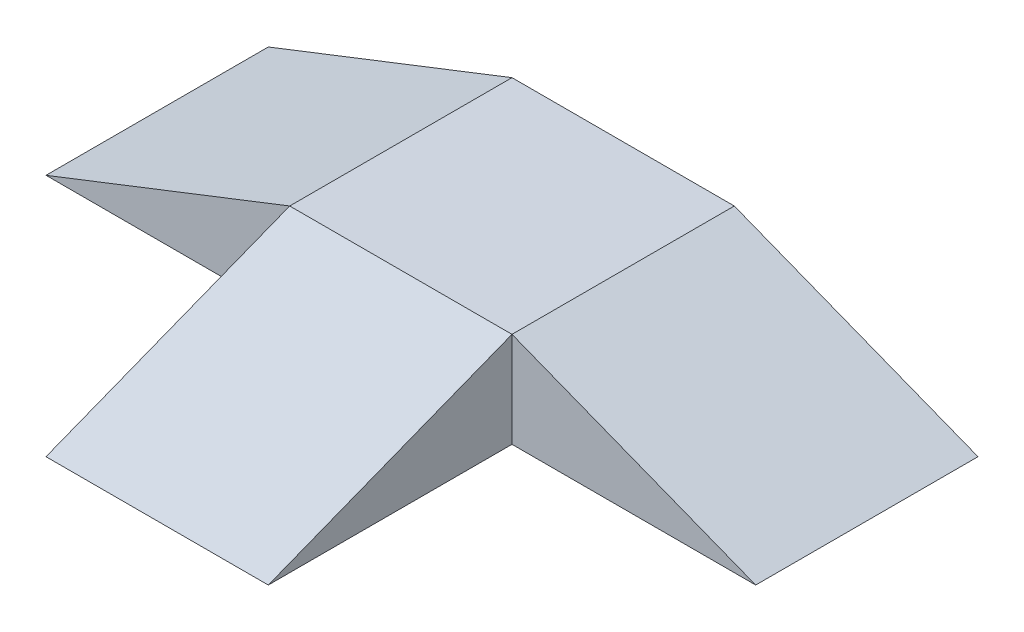
ISO-10303-21;
HEADER;
FILE_DESCRIPTION(('STEP AP214'),'2;1');
FILE_NAME('part.step','',(''),(''),'','','');
FILE_SCHEMA(('AUTOMOTIVE_DESIGN { 1 0 10303 214 1 1 1 1 }'));
ENDSEC;
DATA;
#1=APPLICATION_CONTEXT('core data for automotive mechanical design processes');
#2=APPLICATION_PROTOCOL_DEFINITION('international standard','automotive_design',2000,#1);
#3=PRODUCT_CONTEXT('',#1,'mechanical');
#4=PRODUCT('Part','Part','',(#3));
#5=PRODUCT_RELATED_PRODUCT_CATEGORY('part','',(#4));
#6=PRODUCT_DEFINITION_FORMATION('','',#4);
#7=PRODUCT_DEFINITION_CONTEXT('part definition',#1,'design');
#8=PRODUCT_DEFINITION('design','',#6,#7);
#9=PRODUCT_DEFINITION_SHAPE('','',#8);
#10=(LENGTH_UNIT() NAMED_UNIT(*) SI_UNIT(.MILLI.,.METRE.));
#11=(NAMED_UNIT(*) PLANE_ANGLE_UNIT() SI_UNIT($,.RADIAN.));
#12=(NAMED_UNIT(*) SI_UNIT($,.STERADIAN.) SOLID_ANGLE_UNIT());
#13=UNCERTAINTY_MEASURE_WITH_UNIT(LENGTH_MEASURE(1.E-05),#10,'distance_accuracy_value','');
#14=(GEOMETRIC_REPRESENTATION_CONTEXT(3) GLOBAL_UNCERTAINTY_ASSIGNED_CONTEXT((#13)) GLOBAL_UNIT_ASSIGNED_CONTEXT((#10,
#11,#12)) REPRESENTATION_CONTEXT('',''));
#15=CARTESIAN_POINT('',(0.,0.,0.));
#16=DIRECTION('',(0.,0.,1.));
#17=DIRECTION('',(1.,0.,0.));
#18=AXIS2_PLACEMENT_3D('',#15,#16,#17);
#19=CARTESIAN_POINT('',(175.,150.,175.));
#20=DIRECTION('',(-1.,0.,0.));
#21=DIRECTION('',(0.,0.,1.));
#22=AXIS2_PLACEMENT_3D('',#19,#20,#21);
#23=PLANE('',#22);
#24=DIRECTION('',(0.,-1.,0.));
#25=VECTOR('',#24,1.);
#26=CARTESIAN_POINT('',(175.,150.,175.));
#27=LINE('',#26,#25);
#28=CARTESIAN_POINT('',(175.,150.,175.));
#29=VERTEX_POINT('',#28);
#30=CARTESIAN_POINT('',(175.,0.,175.));
#31=VERTEX_POINT('',#30);
#32=EDGE_CURVE('E57',#29,#31,#27,.T.);
#33=ORIENTED_EDGE('',*,*,#32,.F.);
#34=DIRECTION('',(0.,-0.364077669902913,0.931368589913824));
#35=VECTOR('',#34,1.);
#36=CARTESIAN_POINT('',(175.,0.,558.723859044496));
#37=LINE('',#36,#35);
#38=CARTESIAN_POINT('',(175.,0.,558.723859044496));
#39=VERTEX_POINT('',#38);
#40=EDGE_CURVE('E86',#29,#39,#37,.T.);
#41=ORIENTED_EDGE('',*,*,#40,.T.);
#42=DIRECTION('',(0.,0.,-1.));
#43=VECTOR('',#42,1.);
#44=CARTESIAN_POINT('',(175.,0.,175.));
#45=LINE('',#44,#43);
#46=EDGE_CURVE('E84',#39,#31,#45,.T.);
#47=ORIENTED_EDGE('',*,*,#46,.T.);
#48=EDGE_LOOP('',(#33,#41,#47));
#49=FACE_BOUND('',#48,.T.);
#50=ADVANCED_FACE('F33',(#49),#23,.F.);
#51=CARTESIAN_POINT('',(-175.,150.,175.));
#52=DIRECTION('',(1.,0.,0.));
#53=DIRECTION('',(0.,0.,-1.));
#54=AXIS2_PLACEMENT_3D('',#51,#52,#53);
#55=PLANE('',#54);
#56=DIRECTION('',(0.,1.,0.));
#57=VECTOR('',#56,1.);
#58=CARTESIAN_POINT('',(-175.,0.,175.));
#59=LINE('',#58,#57);
#60=CARTESIAN_POINT('',(-175.,0.,175.));
#61=VERTEX_POINT('',#60);
#62=CARTESIAN_POINT('',(-175.,150.,175.));
#63=VERTEX_POINT('',#62);
#64=EDGE_CURVE('E49',#61,#63,#59,.T.);
#65=ORIENTED_EDGE('',*,*,#64,.F.);
#66=DIRECTION('',(0.,0.,1.));
#67=VECTOR('',#66,1.);
#68=CARTESIAN_POINT('',(-175.,0.,175.));
#69=LINE('',#68,#67);
#70=CARTESIAN_POINT('',(-175.,0.,558.723859044496));
#71=VERTEX_POINT('',#70);
#72=EDGE_CURVE('E36',#61,#71,#69,.T.);
#73=ORIENTED_EDGE('',*,*,#72,.T.);
#74=DIRECTION('',(0.,-0.364077669902913,0.931368589913824));
#75=VECTOR('',#74,1.);
#76=CARTESIAN_POINT('',(-175.,0.,558.723859044496));
#77=LINE('',#76,#75);
#78=EDGE_CURVE('E125',#63,#71,#77,.T.);
#79=ORIENTED_EDGE('',*,*,#78,.F.);
#80=EDGE_LOOP('',(#65,#73,#79));
#81=FACE_BOUND('',#80,.T.);
#82=ADVANCED_FACE('F139',(#81),#55,.F.);
#83=CARTESIAN_POINT('',(-175.,150.,-175.));
#84=DIRECTION('',(0.,0.,1.));
#85=DIRECTION('',(1.,0.,0.));
#86=AXIS2_PLACEMENT_3D('',#83,#84,#85);
#87=PLANE('',#86);
#88=DIRECTION('',(-1.,0.,0.));
#89=VECTOR('',#88,1.);
#90=CARTESIAN_POINT('',(-175.,0.,-175.));
#91=LINE('',#90,#89);
#92=CARTESIAN_POINT('',(558.723859044496,0.,-175.));
#93=VERTEX_POINT('',#92);
#94=CARTESIAN_POINT('',(-558.723859044496,0.,-175.));
#95=VERTEX_POINT('',#94);
#96=EDGE_CURVE('E91',#93,#95,#91,.T.);
#97=ORIENTED_EDGE('',*,*,#96,.T.);
#98=DIRECTION('',(-0.931368589913825,-0.364077669902913,0.));
#99=VECTOR('',#98,1.);
#100=CARTESIAN_POINT('',(-175.,150.,-175.));
#101=LINE('',#100,#99);
#102=CARTESIAN_POINT('',(-175.,150.,-175.));
#103=VERTEX_POINT('',#102);
#104=EDGE_CURVE('E107',#103,#95,#101,.T.);
#105=ORIENTED_EDGE('',*,*,#104,.F.);
#106=DIRECTION('',(-1.,0.,0.));
#107=VECTOR('',#106,1.);
#108=CARTESIAN_POINT('',(-175.,150.,-175.));
#109=LINE('',#108,#107);
#110=CARTESIAN_POINT('',(175.,150.,-175.));
#111=VERTEX_POINT('',#110);
#112=EDGE_CURVE('E133',#111,#103,#109,.T.);
#113=ORIENTED_EDGE('',*,*,#112,.F.);
#114=DIRECTION('',(-0.931368589913825,0.364077669902913,0.));
#115=VECTOR('',#114,1.);
#116=CARTESIAN_POINT('',(558.723859044496,0.,-175.));
#117=LINE('',#116,#115);
#118=EDGE_CURVE('E111',#93,#111,#117,.T.);
#119=ORIENTED_EDGE('',*,*,#118,.F.);
#120=EDGE_LOOP('',(#97,#105,#113,#119));
#121=FACE_BOUND('',#120,.T.);
#122=ADVANCED_FACE('F155',(#121),#87,.F.);
#123=CARTESIAN_POINT('',(0.,150.,0.));
#124=DIRECTION('',(0.,-1.,0.));
#125=DIRECTION('',(0.,0.,-1.));
#126=AXIS2_PLACEMENT_3D('',#123,#124,#125);
#127=PLANE('',#126);
#128=DIRECTION('',(0.,0.,-1.));
#129=VECTOR('',#128,1.);
#130=CARTESIAN_POINT('',(175.,150.,175.));
#131=LINE('',#130,#129);
#132=EDGE_CURVE('E130',#29,#111,#131,.T.);
#133=ORIENTED_EDGE('',*,*,#132,.T.);
#134=ORIENTED_EDGE('',*,*,#112,.T.);
#135=DIRECTION('',(0.,0.,1.));
#136=VECTOR('',#135,1.);
#137=CARTESIAN_POINT('',(-175.,150.,175.));
#138=LINE('',#137,#136);
#139=EDGE_CURVE('E41',#103,#63,#138,.T.);
#140=ORIENTED_EDGE('',*,*,#139,.T.);
#141=DIRECTION('',(1.,0.,0.));
#142=VECTOR('',#141,1.);
#143=CARTESIAN_POINT('',(-175.,150.,175.));
#144=LINE('',#143,#142);
#145=EDGE_CURVE('E11',#63,#29,#144,.T.);
#146=ORIENTED_EDGE('',*,*,#145,.T.);
#147=EDGE_LOOP('',(#133,#134,#140,#146));
#148=FACE_BOUND('',#147,.T.);
#149=ADVANCED_FACE('F147',(#148),#127,.F.);
#150=CARTESIAN_POINT('',(0.,0.,0.));
#151=DIRECTION('',(0.,-1.,0.));
#152=DIRECTION('',(0.,0.,-1.));
#153=AXIS2_PLACEMENT_3D('',#150,#151,#152);
#154=PLANE('',#153);
#155=ORIENTED_EDGE('',*,*,#46,.F.);
#156=DIRECTION('',(-1.,0.,0.));
#157=VECTOR('',#156,1.);
#158=CARTESIAN_POINT('',(175.,0.,558.723859044496));
#159=LINE('',#158,#157);
#160=EDGE_CURVE('E92',#39,#71,#159,.T.);
#161=ORIENTED_EDGE('',*,*,#160,.T.);
#162=ORIENTED_EDGE('',*,*,#72,.F.);
#163=DIRECTION('',(1.,0.,0.));
#164=VECTOR('',#163,1.);
#165=CARTESIAN_POINT('',(-558.723859044496,0.,175.));
#166=LINE('',#165,#164);
#167=CARTESIAN_POINT('',(-558.723859044496,0.,175.));
#168=VERTEX_POINT('',#167);
#169=EDGE_CURVE('E117',#168,#61,#166,.T.);
#170=ORIENTED_EDGE('',*,*,#169,.F.);
#171=DIRECTION('',(0.,0.,-1.));
#172=VECTOR('',#171,1.);
#173=CARTESIAN_POINT('',(-558.723859044496,0.,175.));
#174=LINE('',#173,#172);
#175=EDGE_CURVE('E120',#168,#95,#174,.T.);
#176=ORIENTED_EDGE('',*,*,#175,.T.);
#177=ORIENTED_EDGE('',*,*,#96,.F.);
#178=DIRECTION('',(0.,0.,-1.));
#179=VECTOR('',#178,1.);
#180=CARTESIAN_POINT('',(558.723859044496,0.,175.));
#181=LINE('',#180,#179);
#182=CARTESIAN_POINT('',(558.723859044496,0.,175.));
#183=VERTEX_POINT('',#182);
#184=EDGE_CURVE('E105',#183,#93,#181,.T.);
#185=ORIENTED_EDGE('',*,*,#184,.F.);
#186=DIRECTION('',(1.,0.,0.));
#187=VECTOR('',#186,1.);
#188=CARTESIAN_POINT('',(175.,0.,175.));
#189=LINE('',#188,#187);
#190=EDGE_CURVE('E97',#31,#183,#189,.T.);
#191=ORIENTED_EDGE('',*,*,#190,.F.);
#192=EDGE_LOOP('',(#155,#161,#162,#170,#176,#177,#185,#191));
#193=FACE_BOUND('',#192,.T.);
#194=ADVANCED_FACE('F103',(#193),#154,.T.);
#195=CARTESIAN_POINT('',(175.,0.,558.723859044496));
#196=DIRECTION('',(0.,-0.931368589913824,-0.364077669902913));
#197=DIRECTION('',(0.,0.364077669902913,-0.931368589913825));
#198=AXIS2_PLACEMENT_3D('',#195,#196,#197);
#199=PLANE('',#198);
#200=ORIENTED_EDGE('',*,*,#78,.T.);
#201=ORIENTED_EDGE('',*,*,#160,.F.);
#202=ORIENTED_EDGE('',*,*,#40,.F.);
#203=ORIENTED_EDGE('',*,*,#145,.F.);
#204=EDGE_LOOP('',(#200,#201,#202,#203));
#205=FACE_BOUND('',#204,.T.);
#206=ADVANCED_FACE('F143',(#205),#199,.F.);
#207=CARTESIAN_POINT('',(-175.,150.,175.));
#208=DIRECTION('',(0.364077669902913,-0.931368589913825,0.));
#209=DIRECTION('',(0.931368589913825,0.364077669902913,0.));
#210=AXIS2_PLACEMENT_3D('',#207,#208,#209);
#211=PLANE('',#210);
#212=ORIENTED_EDGE('',*,*,#104,.T.);
#213=ORIENTED_EDGE('',*,*,#175,.F.);
#214=DIRECTION('',(-0.931368589913825,-0.364077669902913,0.));
#215=VECTOR('',#214,1.);
#216=CARTESIAN_POINT('',(-175.,150.,175.));
#217=LINE('',#216,#215);
#218=EDGE_CURVE('E115',#63,#168,#217,.T.);
#219=ORIENTED_EDGE('',*,*,#218,.F.);
#220=ORIENTED_EDGE('',*,*,#139,.F.);
#221=EDGE_LOOP('',(#212,#213,#219,#220));
#222=FACE_BOUND('',#221,.T.);
#223=ADVANCED_FACE('F150',(#222),#211,.F.);
#224=CARTESIAN_POINT('',(0.,0.,175.));
#225=DIRECTION('',(0.,0.,-1.));
#226=DIRECTION('',(-1.,0.,0.));
#227=AXIS2_PLACEMENT_3D('',#224,#225,#226);
#228=PLANE('',#227);
#229=ORIENTED_EDGE('',*,*,#64,.T.);
#230=ORIENTED_EDGE('',*,*,#218,.T.);
#231=ORIENTED_EDGE('',*,*,#169,.T.);
#232=EDGE_LOOP('',(#229,#230,#231));
#233=FACE_BOUND('',#232,.T.);
#234=ADVANCED_FACE('F152',(#233),#228,.F.);
#235=CARTESIAN_POINT('',(558.723859044496,0.,175.));
#236=DIRECTION('',(-0.364077669902913,-0.931368589913825,0.));
#237=DIRECTION('',(0.931368589913825,-0.364077669902913,0.));
#238=AXIS2_PLACEMENT_3D('',#235,#236,#237);
#239=PLANE('',#238);
#240=ORIENTED_EDGE('',*,*,#118,.T.);
#241=ORIENTED_EDGE('',*,*,#132,.F.);
#242=DIRECTION('',(-0.931368589913825,0.364077669902913,0.));
#243=VECTOR('',#242,1.);
#244=CARTESIAN_POINT('',(558.723859044496,0.,175.));
#245=LINE('',#244,#243);
#246=EDGE_CURVE('E100',#183,#29,#245,.T.);
#247=ORIENTED_EDGE('',*,*,#246,.F.);
#248=ORIENTED_EDGE('',*,*,#184,.T.);
#249=EDGE_LOOP('',(#240,#241,#247,#248));
#250=FACE_BOUND('',#249,.T.);
#251=ADVANCED_FACE('F154',(#250),#239,.F.);
#252=CARTESIAN_POINT('',(0.,0.,175.));
#253=DIRECTION('',(0.,0.,1.));
#254=DIRECTION('',(1.,0.,0.));
#255=AXIS2_PLACEMENT_3D('',#252,#253,#254);
#256=PLANE('',#255);
#257=ORIENTED_EDGE('',*,*,#246,.T.);
#258=ORIENTED_EDGE('',*,*,#32,.T.);
#259=ORIENTED_EDGE('',*,*,#190,.T.);
#260=EDGE_LOOP('',(#257,#258,#259));
#261=FACE_BOUND('',#260,.T.);
#262=ADVANCED_FACE('F96',(#261),#256,.T.);
#263=CLOSED_SHELL('',(#50,#82,#122,#149,#194,#206,#223,#234,#251,#262));
#264=MANIFOLD_SOLID_BREP('B2',#263);
#265=ADVANCED_BREP_SHAPE_REPRESENTATION('',(#18,#264),#14);
#266=SHAPE_DEFINITION_REPRESENTATION(#9,#265);
ENDSEC;
END-ISO-10303-21;
